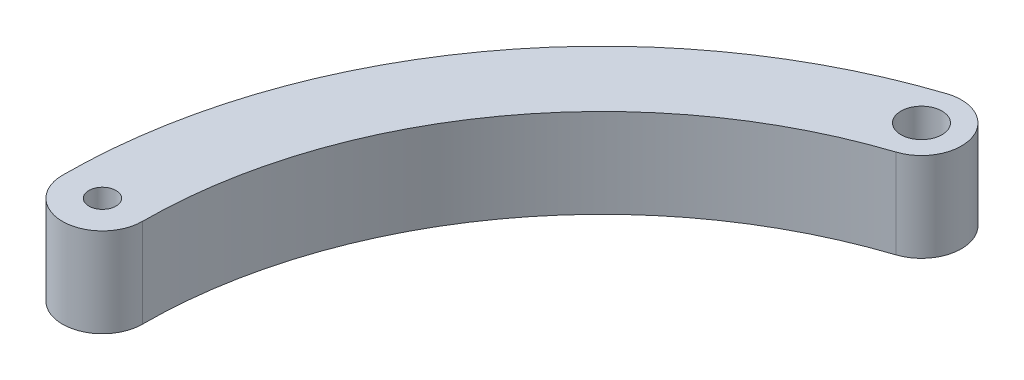
ISO-10303-21;
HEADER;
FILE_DESCRIPTION(('STEP AP214'),'2;1');
FILE_NAME('part.step','',(''),(''),'','','');
FILE_SCHEMA(('AUTOMOTIVE_DESIGN { 1 0 10303 214 1 1 1 1 }'));
ENDSEC;
DATA;
#1=APPLICATION_CONTEXT('core data for automotive mechanical design processes');
#2=APPLICATION_PROTOCOL_DEFINITION('international standard','automotive_design',2000,#1);
#3=PRODUCT_CONTEXT('',#1,'mechanical');
#4=PRODUCT('Part','Part','',(#3));
#5=PRODUCT_RELATED_PRODUCT_CATEGORY('part','',(#4));
#6=PRODUCT_DEFINITION_FORMATION('','',#4);
#7=PRODUCT_DEFINITION_CONTEXT('part definition',#1,'design');
#8=PRODUCT_DEFINITION('design','',#6,#7);
#9=PRODUCT_DEFINITION_SHAPE('','',#8);
#10=(LENGTH_UNIT() NAMED_UNIT(*) SI_UNIT(.MILLI.,.METRE.));
#11=(NAMED_UNIT(*) PLANE_ANGLE_UNIT() SI_UNIT($,.RADIAN.));
#12=(NAMED_UNIT(*) SI_UNIT($,.STERADIAN.) SOLID_ANGLE_UNIT());
#13=UNCERTAINTY_MEASURE_WITH_UNIT(LENGTH_MEASURE(1.E-05),#10,'distance_accuracy_value','');
#14=(GEOMETRIC_REPRESENTATION_CONTEXT(3) GLOBAL_UNCERTAINTY_ASSIGNED_CONTEXT((#13)) GLOBAL_UNIT_ASSIGNED_CONTEXT((#10,
#11,#12)) REPRESENTATION_CONTEXT('',''));
#15=CARTESIAN_POINT('',(0.,0.,0.));
#16=DIRECTION('',(0.,0.,1.));
#17=DIRECTION('',(1.,0.,0.));
#18=AXIS2_PLACEMENT_3D('',#15,#16,#17);
#19=CARTESIAN_POINT('',(-18.25625,6.51002,0.));
#20=DIRECTION('',(0.,-1.,0.));
#21=DIRECTION('',(0.,0.,-1.));
#22=AXIS2_PLACEMENT_3D('',#19,#20,#21);
#23=PLANE('',#22);
#24=CARTESIAN_POINT('',(-36.5125,6.51002,0.));
#25=DIRECTION('',(0.,1.,0.));
#26=DIRECTION('',(0.,0.,-1.));
#27=AXIS2_PLACEMENT_3D('',#24,#25,#26);
#28=CIRCLE('',#27,2.9219891931734);
#29=CARTESIAN_POINT('',(-39.4344891931734,6.51002,0.));
#30=VERTEX_POINT('',#29);
#31=CARTESIAN_POINT('',(-33.5905108068266,6.51002,0.));
#32=VERTEX_POINT('',#31);
#33=EDGE_CURVE('E92',#30,#32,#28,.T.);
#34=ORIENTED_EDGE('',*,*,#33,.T.);
#35=CARTESIAN_POINT('',(0.,6.51002,0.));
#36=DIRECTION('',(0.,-1.,0.));
#37=DIRECTION('',(0.,0.,-1.));
#38=AXIS2_PLACEMENT_3D('',#35,#36,#37);
#39=CIRCLE('',#38,33.5905108068266);
#40=CARTESIAN_POINT('',(-10.4454423964517,6.51002,-31.9251491681079));
#41=VERTEX_POINT('',#40);
#42=EDGE_CURVE('E87',#32,#41,#39,.T.);
#43=ORIENTED_EDGE('',*,*,#42,.T.);
#44=CARTESIAN_POINT('',(-11.3540760869565,6.51002,-34.7022709986191));
#45=DIRECTION('',(0.,1.,0.));
#46=DIRECTION('',(0.,0.,1.));
#47=AXIS2_PLACEMENT_3D('',#44,#45,#46);
#48=CIRCLE('',#47,2.9219891931734);
#49=CARTESIAN_POINT('',(-12.2627097774613,6.51002,-37.4793928291303));
#50=VERTEX_POINT('',#49);
#51=EDGE_CURVE('E90',#41,#50,#48,.T.);
#52=ORIENTED_EDGE('',*,*,#51,.T.);
#53=CARTESIAN_POINT('',(0.,6.51002,0.));
#54=DIRECTION('',(0.,1.,0.));
#55=DIRECTION('',(0.,0.,-1.));
#56=AXIS2_PLACEMENT_3D('',#53,#54,#55);
#57=CIRCLE('',#56,39.4344891931734);
#58=EDGE_CURVE('E57',#50,#30,#57,.T.);
#59=ORIENTED_EDGE('',*,*,#58,.T.);
#60=EDGE_LOOP('',(#34,#43,#52,#59));
#61=FACE_BOUND('',#60,.T.);
#62=CARTESIAN_POINT('',(-11.3540760869565,6.51002,-34.7022709986191));
#63=DIRECTION('',(0.,1.,0.));
#64=DIRECTION('',(0.,0.,1.));
#65=AXIS2_PLACEMENT_3D('',#62,#63,#64);
#66=CIRCLE('',#65,1.5);
#67=CARTESIAN_POINT('',(-11.3540760869565,6.51002,-33.2022709986191));
#68=VERTEX_POINT('',#67);
#69=EDGE_CURVE('E112',#68,#68,#66,.T.);
#70=ORIENTED_EDGE('',*,*,#69,.F.);
#71=EDGE_LOOP('',(#70));
#72=FACE_BOUND('',#71,.T.);
#73=CARTESIAN_POINT('',(-36.5125,6.51002,0.));
#74=DIRECTION('',(0.,1.,0.));
#75=DIRECTION('',(0.,0.,1.));
#76=AXIS2_PLACEMENT_3D('',#73,#74,#75);
#77=CIRCLE('',#76,0.992187499999998);
#78=CARTESIAN_POINT('',(-36.5125,6.51002,0.992187499999998));
#79=VERTEX_POINT('',#78);
#80=EDGE_CURVE('E134',#79,#79,#77,.T.);
#81=ORIENTED_EDGE('',*,*,#80,.F.);
#82=EDGE_LOOP('',(#81));
#83=FACE_BOUND('',#82,.T.);
#84=ADVANCED_FACE('F39',(#61,#72,#83),#23,.F.);
#85=CARTESIAN_POINT('',(-18.25625,0.,0.));
#86=DIRECTION('',(0.,-1.,0.));
#87=DIRECTION('',(0.,0.,-1.));
#88=AXIS2_PLACEMENT_3D('',#85,#86,#87);
#89=PLANE('',#88);
#90=CARTESIAN_POINT('',(-11.3540760869565,0.,-34.7022709986191));
#91=DIRECTION('',(0.,1.,0.));
#92=DIRECTION('',(0.,0.,1.));
#93=AXIS2_PLACEMENT_3D('',#90,#91,#92);
#94=CIRCLE('',#93,1.5);
#95=CARTESIAN_POINT('',(-11.3540760869565,0.,-33.2022709986191));
#96=VERTEX_POINT('',#95);
#97=EDGE_CURVE('E130',#96,#96,#94,.T.);
#98=ORIENTED_EDGE('',*,*,#97,.T.);
#99=EDGE_LOOP('',(#98));
#100=FACE_BOUND('',#99,.T.);
#101=CARTESIAN_POINT('',(-36.5125,0.,0.));
#102=DIRECTION('',(0.,1.,0.));
#103=DIRECTION('',(0.,0.,-1.));
#104=AXIS2_PLACEMENT_3D('',#101,#102,#103);
#105=CIRCLE('',#104,2.9219891931734);
#106=CARTESIAN_POINT('',(-39.4344891931734,0.,0.));
#107=VERTEX_POINT('',#106);
#108=CARTESIAN_POINT('',(-33.5905108068266,0.,0.));
#109=VERTEX_POINT('',#108);
#110=EDGE_CURVE('E108',#107,#109,#105,.T.);
#111=ORIENTED_EDGE('',*,*,#110,.F.);
#112=CARTESIAN_POINT('',(0.,0.,0.));
#113=DIRECTION('',(0.,1.,0.));
#114=DIRECTION('',(0.,0.,-1.));
#115=AXIS2_PLACEMENT_3D('',#112,#113,#114);
#116=CIRCLE('',#115,39.4344891931734);
#117=CARTESIAN_POINT('',(-12.2627097774613,0.,-37.4793928291303));
#118=VERTEX_POINT('',#117);
#119=EDGE_CURVE('E80',#118,#107,#116,.T.);
#120=ORIENTED_EDGE('',*,*,#119,.F.);
#121=CARTESIAN_POINT('',(-11.3540760869565,0.,-34.7022709986191));
#122=DIRECTION('',(0.,1.,0.));
#123=DIRECTION('',(0.,0.,1.));
#124=AXIS2_PLACEMENT_3D('',#121,#122,#123);
#125=CIRCLE('',#124,2.9219891931734);
#126=CARTESIAN_POINT('',(-10.4454423964517,0.,-31.9251491681079));
#127=VERTEX_POINT('',#126);
#128=EDGE_CURVE('E74',#127,#118,#125,.T.);
#129=ORIENTED_EDGE('',*,*,#128,.F.);
#130=CARTESIAN_POINT('',(0.,0.,0.));
#131=DIRECTION('',(0.,-1.,0.));
#132=DIRECTION('',(0.,0.,-1.));
#133=AXIS2_PLACEMENT_3D('',#130,#131,#132);
#134=CIRCLE('',#133,33.5905108068266);
#135=EDGE_CURVE('E97',#109,#127,#134,.T.);
#136=ORIENTED_EDGE('',*,*,#135,.F.);
#137=EDGE_LOOP('',(#111,#120,#129,#136));
#138=FACE_BOUND('',#137,.T.);
#139=CARTESIAN_POINT('',(-36.5125,0.,0.));
#140=DIRECTION('',(0.,1.,0.));
#141=DIRECTION('',(0.,0.,1.));
#142=AXIS2_PLACEMENT_3D('',#139,#140,#141);
#143=CIRCLE('',#142,0.992187499999998);
#144=CARTESIAN_POINT('',(-36.5125,0.,0.992187499999998));
#145=VERTEX_POINT('',#144);
#146=EDGE_CURVE('E138',#145,#145,#143,.T.);
#147=ORIENTED_EDGE('',*,*,#146,.T.);
#148=EDGE_LOOP('',(#147));
#149=FACE_BOUND('',#148,.T.);
#150=ADVANCED_FACE('F125',(#100,#138,#149),#89,.T.);
#151=CARTESIAN_POINT('',(-36.5125,6.51002,0.));
#152=DIRECTION('',(0.,-1.,0.));
#153=DIRECTION('',(0.,0.,-1.));
#154=AXIS2_PLACEMENT_3D('',#151,#152,#153);
#155=CYLINDRICAL_SURFACE('',#154,2.9219891931734);
#156=ORIENTED_EDGE('',*,*,#110,.T.);
#157=DIRECTION('',(0.,-1.,0.));
#158=VECTOR('',#157,1.);
#159=CARTESIAN_POINT('',(-33.5905108068266,6.51002,0.));
#160=LINE('',#159,#158);
#161=EDGE_CURVE('E11',#32,#109,#160,.T.);
#162=ORIENTED_EDGE('',*,*,#161,.F.);
#163=ORIENTED_EDGE('',*,*,#33,.F.);
#164=DIRECTION('',(0.,-1.,0.));
#165=VECTOR('',#164,1.);
#166=CARTESIAN_POINT('',(-39.4344891931734,6.51002,0.));
#167=LINE('',#166,#165);
#168=EDGE_CURVE('E104',#30,#107,#167,.T.);
#169=ORIENTED_EDGE('',*,*,#168,.T.);
#170=EDGE_LOOP('',(#156,#162,#163,#169));
#171=FACE_BOUND('',#170,.T.);
#172=ADVANCED_FACE('F41',(#171),#155,.T.);
#173=CARTESIAN_POINT('',(0.,6.51002,0.));
#174=DIRECTION('',(0.,-1.,0.));
#175=DIRECTION('',(0.,0.,-1.));
#176=AXIS2_PLACEMENT_3D('',#173,#174,#175);
#177=CYLINDRICAL_SURFACE('',#176,33.5905108068266);
#178=ORIENTED_EDGE('',*,*,#135,.T.);
#179=DIRECTION('',(0.,-1.,0.));
#180=VECTOR('',#179,1.);
#181=CARTESIAN_POINT('',(-10.4454423964517,6.51002,-31.9251491681079));
#182=LINE('',#181,#180);
#183=EDGE_CURVE('E49',#41,#127,#182,.T.);
#184=ORIENTED_EDGE('',*,*,#183,.F.);
#185=ORIENTED_EDGE('',*,*,#42,.F.);
#186=ORIENTED_EDGE('',*,*,#161,.T.);
#187=EDGE_LOOP('',(#178,#184,#185,#186));
#188=FACE_BOUND('',#187,.T.);
#189=ADVANCED_FACE('F96',(#188),#177,.F.);
#190=CARTESIAN_POINT('',(-11.3540760869565,6.51002,-34.7022709986191));
#191=DIRECTION('',(0.,-1.,0.));
#192=DIRECTION('',(0.,0.,-1.));
#193=AXIS2_PLACEMENT_3D('',#190,#191,#192);
#194=CYLINDRICAL_SURFACE('',#193,2.9219891931734);
#195=ORIENTED_EDGE('',*,*,#128,.T.);
#196=DIRECTION('',(0.,-1.,0.));
#197=VECTOR('',#196,1.);
#198=CARTESIAN_POINT('',(-12.2627097774613,6.51002,-37.4793928291303));
#199=LINE('',#198,#197);
#200=EDGE_CURVE('E99',#50,#118,#199,.T.);
#201=ORIENTED_EDGE('',*,*,#200,.F.);
#202=ORIENTED_EDGE('',*,*,#51,.F.);
#203=ORIENTED_EDGE('',*,*,#183,.T.);
#204=EDGE_LOOP('',(#195,#201,#202,#203));
#205=FACE_BOUND('',#204,.T.);
#206=ADVANCED_FACE('F100',(#205),#194,.T.);
#207=CARTESIAN_POINT('',(0.,6.51002,0.));
#208=DIRECTION('',(0.,-1.,0.));
#209=DIRECTION('',(0.,0.,-1.));
#210=AXIS2_PLACEMENT_3D('',#207,#208,#209);
#211=CYLINDRICAL_SURFACE('',#210,39.4344891931734);
#212=ORIENTED_EDGE('',*,*,#119,.T.);
#213=ORIENTED_EDGE('',*,*,#168,.F.);
#214=ORIENTED_EDGE('',*,*,#58,.F.);
#215=ORIENTED_EDGE('',*,*,#200,.T.);
#216=EDGE_LOOP('',(#212,#213,#214,#215));
#217=FACE_BOUND('',#216,.T.);
#218=ADVANCED_FACE('F122',(#217),#211,.T.);
#219=CARTESIAN_POINT('',(-11.3540760869565,6.51002,-34.7022709986191));
#220=DIRECTION('',(0.,-1.,0.));
#221=DIRECTION('',(0.,0.,-1.));
#222=AXIS2_PLACEMENT_3D('',#219,#220,#221);
#223=CYLINDRICAL_SURFACE('',#222,1.5);
#224=ORIENTED_EDGE('',*,*,#69,.T.);
#225=EDGE_LOOP('',(#224));
#226=FACE_BOUND('',#225,.T.);
#227=ORIENTED_EDGE('',*,*,#97,.F.);
#228=EDGE_LOOP('',(#227));
#229=FACE_BOUND('',#228,.T.);
#230=ADVANCED_FACE('F157',(#226,#229),#223,.F.);
#231=CARTESIAN_POINT('',(-36.5125,6.51002,0.));
#232=DIRECTION('',(0.,-1.,0.));
#233=DIRECTION('',(0.,0.,-1.));
#234=AXIS2_PLACEMENT_3D('',#231,#232,#233);
#235=CYLINDRICAL_SURFACE('',#234,0.992187499999998);
#236=ORIENTED_EDGE('',*,*,#80,.T.);
#237=EDGE_LOOP('',(#236));
#238=FACE_BOUND('',#237,.T.);
#239=ORIENTED_EDGE('',*,*,#146,.F.);
#240=EDGE_LOOP('',(#239));
#241=FACE_BOUND('',#240,.T.);
#242=ADVANCED_FACE('F146',(#238,#241),#235,.F.);
#243=CLOSED_SHELL('',(#84,#150,#172,#189,#206,#218,#230,#242));
#244=MANIFOLD_SOLID_BREP('B2',#243);
#245=ADVANCED_BREP_SHAPE_REPRESENTATION('',(#18,#244),#14);
#246=SHAPE_DEFINITION_REPRESENTATION(#9,#245);
ENDSEC;
END-ISO-10303-21;
